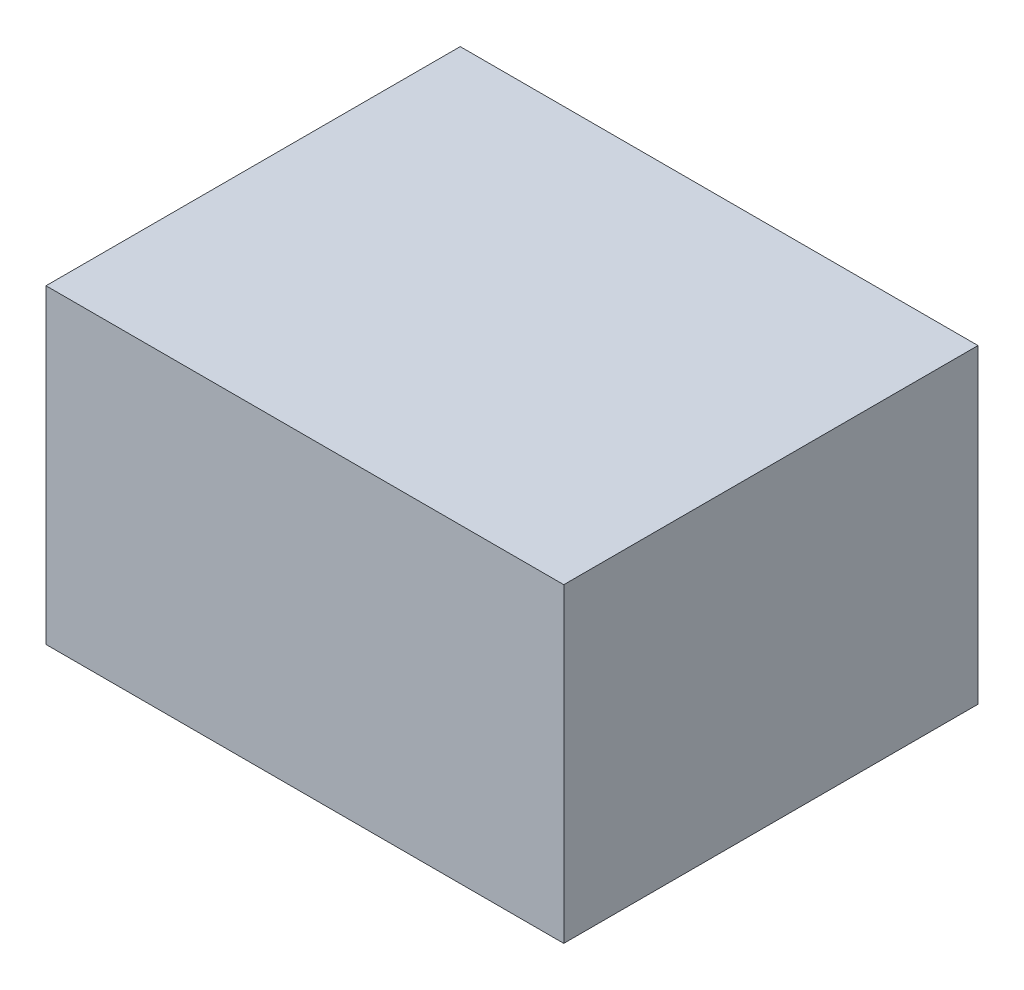
ISO-10303-21;
HEADER;
FILE_DESCRIPTION(('STEP AP214'),'2;1');
FILE_NAME('part.step','',(''),(''),'','','');
FILE_SCHEMA(('AUTOMOTIVE_DESIGN { 1 0 10303 214 1 1 1 1 }'));
ENDSEC;
DATA;
#1=APPLICATION_CONTEXT('core data for automotive mechanical design processes');
#2=APPLICATION_PROTOCOL_DEFINITION('international standard','automotive_design',2000,#1);
#3=PRODUCT_CONTEXT('',#1,'mechanical');
#4=PRODUCT('Part','Part','',(#3));
#5=PRODUCT_RELATED_PRODUCT_CATEGORY('part','',(#4));
#6=PRODUCT_DEFINITION_FORMATION('','',#4);
#7=PRODUCT_DEFINITION_CONTEXT('part definition',#1,'design');
#8=PRODUCT_DEFINITION('design','',#6,#7);
#9=PRODUCT_DEFINITION_SHAPE('','',#8);
#10=(LENGTH_UNIT() NAMED_UNIT(*) SI_UNIT(.MILLI.,.METRE.));
#11=(NAMED_UNIT(*) PLANE_ANGLE_UNIT() SI_UNIT($,.RADIAN.));
#12=(NAMED_UNIT(*) SI_UNIT($,.STERADIAN.) SOLID_ANGLE_UNIT());
#13=UNCERTAINTY_MEASURE_WITH_UNIT(LENGTH_MEASURE(1.E-05),#10,'distance_accuracy_value','');
#14=(GEOMETRIC_REPRESENTATION_CONTEXT(3) GLOBAL_UNCERTAINTY_ASSIGNED_CONTEXT((#13)) GLOBAL_UNIT_ASSIGNED_CONTEXT((#10,
#11,#12)) REPRESENTATION_CONTEXT('',''));
#15=CARTESIAN_POINT('',(0.,0.,0.));
#16=DIRECTION('',(0.,0.,1.));
#17=DIRECTION('',(1.,0.,0.));
#18=AXIS2_PLACEMENT_3D('',#15,#16,#17);
#19=CARTESIAN_POINT('',(12.5,7.5,20.));
#20=DIRECTION('',(-1.,0.,0.));
#21=DIRECTION('',(0.,-1.,0.));
#22=AXIS2_PLACEMENT_3D('',#19,#20,#21);
#23=PLANE('',#22);
#24=DIRECTION('',(0.,1.,0.));
#25=VECTOR('',#24,1.);
#26=CARTESIAN_POINT('',(12.5,7.5,0.));
#27=LINE('',#26,#25);
#28=CARTESIAN_POINT('',(12.5,-7.5,0.));
#29=VERTEX_POINT('',#28);
#30=CARTESIAN_POINT('',(12.5,7.5,0.));
#31=VERTEX_POINT('',#30);
#32=EDGE_CURVE('E102',#29,#31,#27,.T.);
#33=ORIENTED_EDGE('',*,*,#32,.T.);
#34=DIRECTION('',(0.,0.,-1.));
#35=VECTOR('',#34,1.);
#36=CARTESIAN_POINT('',(12.5,7.5,20.));
#37=LINE('',#36,#35);
#38=CARTESIAN_POINT('',(12.5,7.5,20.));
#39=VERTEX_POINT('',#38);
#40=EDGE_CURVE('E11',#39,#31,#37,.T.);
#41=ORIENTED_EDGE('',*,*,#40,.F.);
#42=DIRECTION('',(0.,1.,0.));
#43=VECTOR('',#42,1.);
#44=CARTESIAN_POINT('',(12.5,7.5,20.));
#45=LINE('',#44,#43);
#46=CARTESIAN_POINT('',(12.5,-7.5,20.));
#47=VERTEX_POINT('',#46);
#48=EDGE_CURVE('E90',#47,#39,#45,.T.);
#49=ORIENTED_EDGE('',*,*,#48,.F.);
#50=DIRECTION('',(0.,0.,-1.));
#51=VECTOR('',#50,1.);
#52=CARTESIAN_POINT('',(12.5,-7.5,20.));
#53=LINE('',#52,#51);
#54=EDGE_CURVE('E98',#47,#29,#53,.T.);
#55=ORIENTED_EDGE('',*,*,#54,.T.);
#56=EDGE_LOOP('',(#33,#41,#49,#55));
#57=FACE_BOUND('',#56,.T.);
#58=ADVANCED_FACE('F39',(#57),#23,.F.);
#59=CARTESIAN_POINT('',(-12.5,7.5,20.));
#60=DIRECTION('',(0.,-1.,0.));
#61=DIRECTION('',(0.,0.,-1.));
#62=AXIS2_PLACEMENT_3D('',#59,#60,#61);
#63=PLANE('',#62);
#64=DIRECTION('',(-1.,0.,0.));
#65=VECTOR('',#64,1.);
#66=CARTESIAN_POINT('',(-12.5,7.5,0.));
#67=LINE('',#66,#65);
#68=CARTESIAN_POINT('',(-12.5,7.5,0.));
#69=VERTEX_POINT('',#68);
#70=EDGE_CURVE('E94',#31,#69,#67,.T.);
#71=ORIENTED_EDGE('',*,*,#70,.T.);
#72=DIRECTION('',(0.,0.,-1.));
#73=VECTOR('',#72,1.);
#74=CARTESIAN_POINT('',(-12.5,7.5,20.));
#75=LINE('',#74,#73);
#76=CARTESIAN_POINT('',(-12.5,7.5,20.));
#77=VERTEX_POINT('',#76);
#78=EDGE_CURVE('E47',#77,#69,#75,.T.);
#79=ORIENTED_EDGE('',*,*,#78,.F.);
#80=DIRECTION('',(-1.,0.,0.));
#81=VECTOR('',#80,1.);
#82=CARTESIAN_POINT('',(-12.5,7.5,20.));
#83=LINE('',#82,#81);
#84=EDGE_CURVE('E85',#39,#77,#83,.T.);
#85=ORIENTED_EDGE('',*,*,#84,.F.);
#86=ORIENTED_EDGE('',*,*,#40,.T.);
#87=EDGE_LOOP('',(#71,#79,#85,#86));
#88=FACE_BOUND('',#87,.T.);
#89=ADVANCED_FACE('F93',(#88),#63,.F.);
#90=CARTESIAN_POINT('',(-12.5,7.5,20.));
#91=DIRECTION('',(1.,0.,0.));
#92=DIRECTION('',(0.,1.,0.));
#93=AXIS2_PLACEMENT_3D('',#90,#91,#92);
#94=PLANE('',#93);
#95=DIRECTION('',(0.,-1.,0.));
#96=VECTOR('',#95,1.);
#97=CARTESIAN_POINT('',(-12.5,7.5,0.));
#98=LINE('',#97,#96);
#99=CARTESIAN_POINT('',(-12.5,-7.5,0.));
#100=VERTEX_POINT('',#99);
#101=EDGE_CURVE('E72',#69,#100,#98,.T.);
#102=ORIENTED_EDGE('',*,*,#101,.T.);
#103=DIRECTION('',(0.,0.,-1.));
#104=VECTOR('',#103,1.);
#105=CARTESIAN_POINT('',(-12.5,-7.5,20.));
#106=LINE('',#105,#104);
#107=CARTESIAN_POINT('',(-12.5,-7.5,20.));
#108=VERTEX_POINT('',#107);
#109=EDGE_CURVE('E95',#108,#100,#106,.T.);
#110=ORIENTED_EDGE('',*,*,#109,.F.);
#111=DIRECTION('',(0.,-1.,0.));
#112=VECTOR('',#111,1.);
#113=CARTESIAN_POINT('',(-12.5,7.5,20.));
#114=LINE('',#113,#112);
#115=EDGE_CURVE('E88',#77,#108,#114,.T.);
#116=ORIENTED_EDGE('',*,*,#115,.F.);
#117=ORIENTED_EDGE('',*,*,#78,.T.);
#118=EDGE_LOOP('',(#102,#110,#116,#117));
#119=FACE_BOUND('',#118,.T.);
#120=ADVANCED_FACE('F96',(#119),#94,.F.);
#121=CARTESIAN_POINT('',(-12.5,-7.5,20.));
#122=DIRECTION('',(0.,1.,0.));
#123=DIRECTION('',(0.,0.,1.));
#124=AXIS2_PLACEMENT_3D('',#121,#122,#123);
#125=PLANE('',#124);
#126=DIRECTION('',(1.,0.,0.));
#127=VECTOR('',#126,1.);
#128=CARTESIAN_POINT('',(-12.5,-7.5,0.));
#129=LINE('',#128,#127);
#130=EDGE_CURVE('E78',#100,#29,#129,.T.);
#131=ORIENTED_EDGE('',*,*,#130,.T.);
#132=ORIENTED_EDGE('',*,*,#54,.F.);
#133=DIRECTION('',(1.,0.,0.));
#134=VECTOR('',#133,1.);
#135=CARTESIAN_POINT('',(-12.5,-7.5,20.));
#136=LINE('',#135,#134);
#137=EDGE_CURVE('E55',#108,#47,#136,.T.);
#138=ORIENTED_EDGE('',*,*,#137,.F.);
#139=ORIENTED_EDGE('',*,*,#109,.T.);
#140=EDGE_LOOP('',(#131,#132,#138,#139));
#141=FACE_BOUND('',#140,.T.);
#142=ADVANCED_FACE('F109',(#141),#125,.F.);
#143=CARTESIAN_POINT('',(0.,0.,20.));
#144=DIRECTION('',(0.,0.,1.));
#145=DIRECTION('',(1.,0.,0.));
#146=AXIS2_PLACEMENT_3D('',#143,#144,#145);
#147=PLANE('',#146);
#148=ORIENTED_EDGE('',*,*,#48,.T.);
#149=ORIENTED_EDGE('',*,*,#84,.T.);
#150=ORIENTED_EDGE('',*,*,#115,.T.);
#151=ORIENTED_EDGE('',*,*,#137,.T.);
#152=EDGE_LOOP('',(#148,#149,#150,#151));
#153=FACE_BOUND('',#152,.T.);
#154=ADVANCED_FACE('F86',(#153),#147,.T.);
#155=CARTESIAN_POINT('',(0.,0.,0.));
#156=DIRECTION('',(0.,0.,1.));
#157=DIRECTION('',(1.,0.,0.));
#158=AXIS2_PLACEMENT_3D('',#155,#156,#157);
#159=PLANE('',#158);
#160=ORIENTED_EDGE('',*,*,#32,.F.);
#161=ORIENTED_EDGE('',*,*,#130,.F.);
#162=ORIENTED_EDGE('',*,*,#101,.F.);
#163=ORIENTED_EDGE('',*,*,#70,.F.);
#164=EDGE_LOOP('',(#160,#161,#162,#163));
#165=FACE_BOUND('',#164,.T.);
#166=ADVANCED_FACE('F112',(#165),#159,.F.);
#167=CLOSED_SHELL('',(#58,#89,#120,#142,#154,#166));
#168=MANIFOLD_SOLID_BREP('B2',#167);
#169=ADVANCED_BREP_SHAPE_REPRESENTATION('',(#18,#168),#14);
#170=SHAPE_DEFINITION_REPRESENTATION(#9,#169);
ENDSEC;
END-ISO-10303-21;
